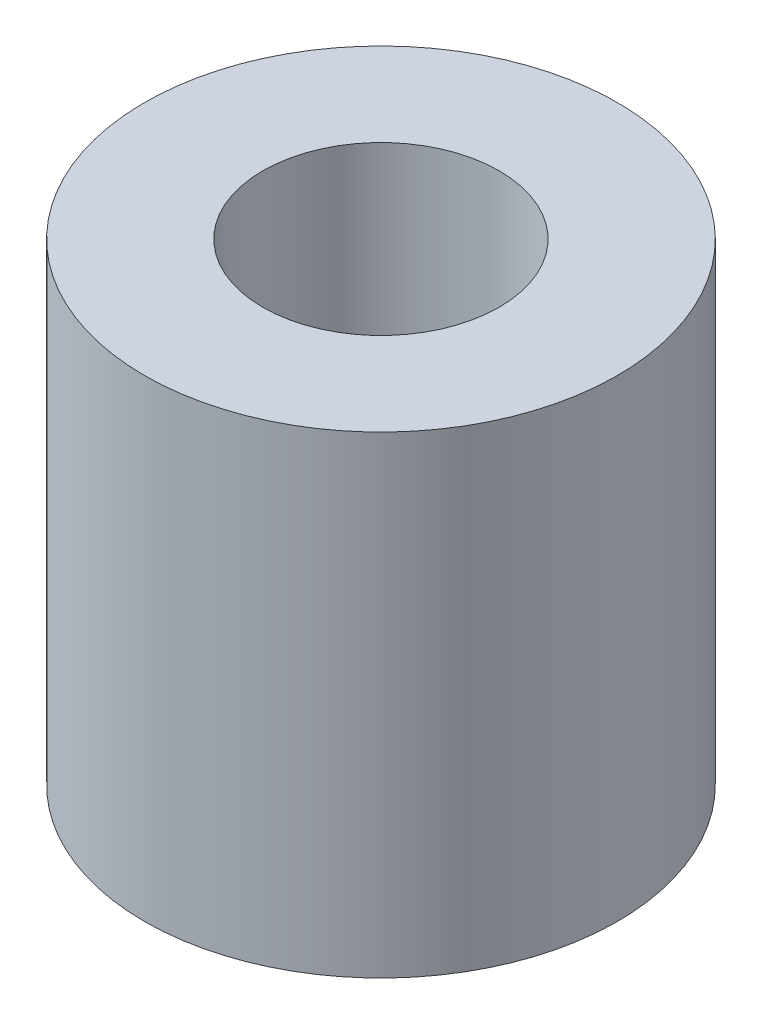
ISO-10303-21;
HEADER;
FILE_DESCRIPTION(('STEP AP214'),'2;1');
FILE_NAME('part.step','',(''),(''),'','','');
FILE_SCHEMA(('AUTOMOTIVE_DESIGN { 1 0 10303 214 1 1 1 1 }'));
ENDSEC;
DATA;
#1=APPLICATION_CONTEXT('core data for automotive mechanical design processes');
#2=APPLICATION_PROTOCOL_DEFINITION('international standard','automotive_design',2000,#1);
#3=PRODUCT_CONTEXT('',#1,'mechanical');
#4=PRODUCT('Part','Part','',(#3));
#5=PRODUCT_RELATED_PRODUCT_CATEGORY('part','',(#4));
#6=PRODUCT_DEFINITION_FORMATION('','',#4);
#7=PRODUCT_DEFINITION_CONTEXT('part definition',#1,'design');
#8=PRODUCT_DEFINITION('design','',#6,#7);
#9=PRODUCT_DEFINITION_SHAPE('','',#8);
#10=(LENGTH_UNIT() NAMED_UNIT(*) SI_UNIT(.MILLI.,.METRE.));
#11=(NAMED_UNIT(*) PLANE_ANGLE_UNIT() SI_UNIT($,.RADIAN.));
#12=(NAMED_UNIT(*) SI_UNIT($,.STERADIAN.) SOLID_ANGLE_UNIT());
#13=UNCERTAINTY_MEASURE_WITH_UNIT(LENGTH_MEASURE(1.E-05),#10,'distance_accuracy_value','');
#14=(GEOMETRIC_REPRESENTATION_CONTEXT(3) GLOBAL_UNCERTAINTY_ASSIGNED_CONTEXT((#13)) GLOBAL_UNIT_ASSIGNED_CONTEXT((#10,
#11,#12)) REPRESENTATION_CONTEXT('',''));
#15=CARTESIAN_POINT('',(0.,0.,0.));
#16=DIRECTION('',(0.,0.,1.));
#17=DIRECTION('',(1.,0.,0.));
#18=AXIS2_PLACEMENT_3D('',#15,#16,#17);
#19=CARTESIAN_POINT('',(0.,4.,0.));
#20=DIRECTION('',(0.,1.,0.));
#21=DIRECTION('',(0.,0.,1.));
#22=AXIS2_PLACEMENT_3D('',#19,#20,#21);
#23=PLANE('',#22);
#24=CARTESIAN_POINT('',(0.,4.,0.));
#25=DIRECTION('',(0.,1.,0.));
#26=DIRECTION('',(0.,0.,1.));
#27=AXIS2_PLACEMENT_3D('',#24,#25,#26);
#28=CIRCLE('',#27,2.);
#29=CARTESIAN_POINT('',(0.,4.,2.));
#30=VERTEX_POINT('',#29);
#31=EDGE_CURVE('E10',#30,#30,#28,.T.);
#32=ORIENTED_EDGE('',*,*,#31,.T.);
#33=EDGE_LOOP('',(#32));
#34=FACE_BOUND('',#33,.T.);
#35=CARTESIAN_POINT('',(0.,4.,0.));
#36=DIRECTION('',(0.,1.,0.));
#37=DIRECTION('',(0.,0.,1.));
#38=AXIS2_PLACEMENT_3D('',#35,#36,#37);
#39=CIRCLE('',#38,1.);
#40=CARTESIAN_POINT('',(0.,4.,1.));
#41=VERTEX_POINT('',#40);
#42=EDGE_CURVE('E56',#41,#41,#39,.T.);
#43=ORIENTED_EDGE('',*,*,#42,.F.);
#44=EDGE_LOOP('',(#43));
#45=FACE_BOUND('',#44,.T.);
#46=ADVANCED_FACE('F43',(#34,#45),#23,.T.);
#47=CARTESIAN_POINT('',(0.,0.,0.));
#48=DIRECTION('',(0.,1.,0.));
#49=DIRECTION('',(0.,0.,1.));
#50=AXIS2_PLACEMENT_3D('',#47,#48,#49);
#51=PLANE('',#50);
#52=CARTESIAN_POINT('',(0.,0.,0.));
#53=DIRECTION('',(0.,1.,0.));
#54=DIRECTION('',(0.,0.,1.));
#55=AXIS2_PLACEMENT_3D('',#52,#53,#54);
#56=CIRCLE('',#55,2.);
#57=CARTESIAN_POINT('',(0.,0.,2.));
#58=VERTEX_POINT('',#57);
#59=EDGE_CURVE('E47',#58,#58,#56,.T.);
#60=ORIENTED_EDGE('',*,*,#59,.F.);
#61=EDGE_LOOP('',(#60));
#62=FACE_BOUND('',#61,.T.);
#63=CARTESIAN_POINT('',(0.,0.,0.));
#64=DIRECTION('',(0.,1.,0.));
#65=DIRECTION('',(0.,0.,1.));
#66=AXIS2_PLACEMENT_3D('',#63,#64,#65);
#67=CIRCLE('',#66,1.);
#68=CARTESIAN_POINT('',(0.,0.,1.));
#69=VERTEX_POINT('',#68);
#70=EDGE_CURVE('E58',#69,#69,#67,.T.);
#71=ORIENTED_EDGE('',*,*,#70,.T.);
#72=EDGE_LOOP('',(#71));
#73=FACE_BOUND('',#72,.T.);
#74=ADVANCED_FACE('F70',(#62,#73),#51,.F.);
#75=CARTESIAN_POINT('',(0.,4.,0.));
#76=DIRECTION('',(0.,-1.,0.));
#77=DIRECTION('',(0.,0.,-1.));
#78=AXIS2_PLACEMENT_3D('',#75,#76,#77);
#79=CYLINDRICAL_SURFACE('',#78,2.);
#80=ORIENTED_EDGE('',*,*,#31,.F.);
#81=EDGE_LOOP('',(#80));
#82=FACE_BOUND('',#81,.T.);
#83=ORIENTED_EDGE('',*,*,#59,.T.);
#84=EDGE_LOOP('',(#83));
#85=FACE_BOUND('',#84,.T.);
#86=ADVANCED_FACE('F45',(#82,#85),#79,.T.);
#87=CARTESIAN_POINT('',(0.,4.,0.));
#88=DIRECTION('',(0.,-1.,0.));
#89=DIRECTION('',(0.,0.,-1.));
#90=AXIS2_PLACEMENT_3D('',#87,#88,#89);
#91=CYLINDRICAL_SURFACE('',#90,1.);
#92=ORIENTED_EDGE('',*,*,#42,.T.);
#93=EDGE_LOOP('',(#92));
#94=FACE_BOUND('',#93,.T.);
#95=ORIENTED_EDGE('',*,*,#70,.F.);
#96=EDGE_LOOP('',(#95));
#97=FACE_BOUND('',#96,.T.);
#98=ADVANCED_FACE('F66',(#94,#97),#91,.F.);
#99=CLOSED_SHELL('',(#46,#74,#86,#98));
#100=MANIFOLD_SOLID_BREP('B2',#99);
#101=ADVANCED_BREP_SHAPE_REPRESENTATION('',(#18,#100),#14);
#102=SHAPE_DEFINITION_REPRESENTATION(#9,#101);
ENDSEC;
END-ISO-10303-21;
